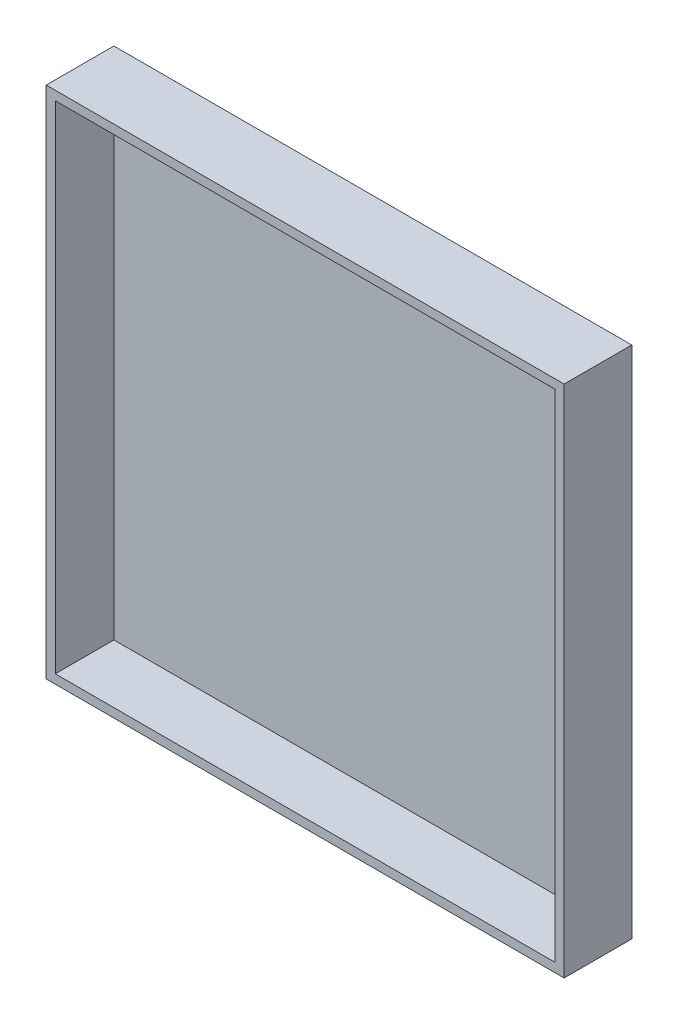
ISO-10303-21;
HEADER;
FILE_DESCRIPTION(('STEP AP214'),'2;1');
FILE_NAME('part.step','',(''),(''),'','','');
FILE_SCHEMA(('AUTOMOTIVE_DESIGN { 1 0 10303 214 1 1 1 1 }'));
ENDSEC;
DATA;
#1=APPLICATION_CONTEXT('core data for automotive mechanical design processes');
#2=APPLICATION_PROTOCOL_DEFINITION('international standard','automotive_design',2000,#1);
#3=PRODUCT_CONTEXT('',#1,'mechanical');
#4=PRODUCT('Part','Part','',(#3));
#5=PRODUCT_RELATED_PRODUCT_CATEGORY('part','',(#4));
#6=PRODUCT_DEFINITION_FORMATION('','',#4);
#7=PRODUCT_DEFINITION_CONTEXT('part definition',#1,'design');
#8=PRODUCT_DEFINITION('design','',#6,#7);
#9=PRODUCT_DEFINITION_SHAPE('','',#8);
#10=(LENGTH_UNIT() NAMED_UNIT(*) SI_UNIT(.MILLI.,.METRE.));
#11=(NAMED_UNIT(*) PLANE_ANGLE_UNIT() SI_UNIT($,.RADIAN.));
#12=(NAMED_UNIT(*) SI_UNIT($,.STERADIAN.) SOLID_ANGLE_UNIT());
#13=UNCERTAINTY_MEASURE_WITH_UNIT(LENGTH_MEASURE(1.E-05),#10,'distance_accuracy_value','');
#14=(GEOMETRIC_REPRESENTATION_CONTEXT(3) GLOBAL_UNCERTAINTY_ASSIGNED_CONTEXT((#13)) GLOBAL_UNIT_ASSIGNED_CONTEXT((#10,
#11,#12)) REPRESENTATION_CONTEXT('',''));
#15=CARTESIAN_POINT('',(0.,0.,0.));
#16=DIRECTION('',(0.,0.,1.));
#17=DIRECTION('',(1.,0.,0.));
#18=AXIS2_PLACEMENT_3D('',#15,#16,#17);
#19=CARTESIAN_POINT('',(4.,0.,15.));
#20=DIRECTION('',(-1.,0.,0.));
#21=DIRECTION('',(0.,0.,1.));
#22=AXIS2_PLACEMENT_3D('',#19,#20,#21);
#23=PLANE('',#22);
#24=DIRECTION('',(0.,1.,0.));
#25=VECTOR('',#24,1.);
#26=CARTESIAN_POINT('',(4.,0.,0.));
#27=LINE('',#26,#25);
#28=CARTESIAN_POINT('',(4.,0.,0.));
#29=VERTEX_POINT('',#28);
#30=CARTESIAN_POINT('',(4.,114.06,0.));
#31=VERTEX_POINT('',#30);
#32=EDGE_CURVE('E140',#29,#31,#27,.T.);
#33=ORIENTED_EDGE('',*,*,#32,.T.);
#34=DIRECTION('',(0.,0.,-1.));
#35=VECTOR('',#34,1.);
#36=CARTESIAN_POINT('',(4.,114.06,15.));
#37=LINE('',#36,#35);
#38=CARTESIAN_POINT('',(4.,114.06,15.));
#39=VERTEX_POINT('',#38);
#40=EDGE_CURVE('E11',#39,#31,#37,.T.);
#41=ORIENTED_EDGE('',*,*,#40,.F.);
#42=DIRECTION('',(0.,1.,0.));
#43=VECTOR('',#42,1.);
#44=CARTESIAN_POINT('',(4.,0.,15.));
#45=LINE('',#44,#43);
#46=CARTESIAN_POINT('',(4.,0.,15.));
#47=VERTEX_POINT('',#46);
#48=EDGE_CURVE('E144',#47,#39,#45,.T.);
#49=ORIENTED_EDGE('',*,*,#48,.F.);
#50=DIRECTION('',(0.,0.,-1.));
#51=VECTOR('',#50,1.);
#52=CARTESIAN_POINT('',(4.,0.,15.));
#53=LINE('',#52,#51);
#54=EDGE_CURVE('E56',#47,#29,#53,.T.);
#55=ORIENTED_EDGE('',*,*,#54,.T.);
#56=EDGE_LOOP('',(#33,#41,#49,#55));
#57=FACE_BOUND('',#56,.T.);
#58=ADVANCED_FACE('F33',(#57),#23,.F.);
#59=CARTESIAN_POINT('',(4.,114.06,15.));
#60=DIRECTION('',(0.,-1.,0.));
#61=DIRECTION('',(1.,0.,0.));
#62=AXIS2_PLACEMENT_3D('',#59,#60,#61);
#63=PLANE('',#62);
#64=DIRECTION('',(-1.,0.,0.));
#65=VECTOR('',#64,1.);
#66=CARTESIAN_POINT('',(4.,114.06,0.));
#67=LINE('',#66,#65);
#68=CARTESIAN_POINT('',(-110.835,114.06,0.));
#69=VERTEX_POINT('',#68);
#70=EDGE_CURVE('E154',#31,#69,#67,.T.);
#71=ORIENTED_EDGE('',*,*,#70,.T.);
#72=DIRECTION('',(0.,0.,-1.));
#73=VECTOR('',#72,1.);
#74=CARTESIAN_POINT('',(-110.835,114.06,15.));
#75=LINE('',#74,#73);
#76=CARTESIAN_POINT('',(-110.835,114.06,15.));
#77=VERTEX_POINT('',#76);
#78=EDGE_CURVE('E40',#77,#69,#75,.T.);
#79=ORIENTED_EDGE('',*,*,#78,.F.);
#80=DIRECTION('',(-1.,0.,0.));
#81=VECTOR('',#80,1.);
#82=CARTESIAN_POINT('',(4.,114.06,15.));
#83=LINE('',#82,#81);
#84=EDGE_CURVE('E82',#39,#77,#83,.T.);
#85=ORIENTED_EDGE('',*,*,#84,.F.);
#86=ORIENTED_EDGE('',*,*,#40,.T.);
#87=EDGE_LOOP('',(#71,#79,#85,#86));
#88=FACE_BOUND('',#87,.T.);
#89=ADVANCED_FACE('F168',(#88),#63,.F.);
#90=CARTESIAN_POINT('',(-110.835,0.,15.));
#91=DIRECTION('',(-1.,0.,0.));
#92=DIRECTION('',(0.,0.,1.));
#93=AXIS2_PLACEMENT_3D('',#90,#91,#92);
#94=PLANE('',#93);
#95=DIRECTION('',(0.,1.,0.));
#96=VECTOR('',#95,1.);
#97=CARTESIAN_POINT('',(-110.835,0.,0.));
#98=LINE('',#97,#96);
#99=CARTESIAN_POINT('',(-110.835,0.,0.));
#100=VERTEX_POINT('',#99);
#101=EDGE_CURVE('E157',#100,#69,#98,.T.);
#102=ORIENTED_EDGE('',*,*,#101,.F.);
#103=DIRECTION('',(0.,0.,-1.));
#104=VECTOR('',#103,1.);
#105=CARTESIAN_POINT('',(-110.835,0.,15.));
#106=LINE('',#105,#104);
#107=CARTESIAN_POINT('',(-110.835,0.,15.));
#108=VERTEX_POINT('',#107);
#109=EDGE_CURVE('E163',#108,#100,#106,.T.);
#110=ORIENTED_EDGE('',*,*,#109,.F.);
#111=DIRECTION('',(0.,1.,0.));
#112=VECTOR('',#111,1.);
#113=CARTESIAN_POINT('',(-110.835,0.,15.));
#114=LINE('',#113,#112);
#115=EDGE_CURVE('E148',#108,#77,#114,.T.);
#116=ORIENTED_EDGE('',*,*,#115,.T.);
#117=ORIENTED_EDGE('',*,*,#78,.T.);
#118=EDGE_LOOP('',(#102,#110,#116,#117));
#119=FACE_BOUND('',#118,.T.);
#120=ADVANCED_FACE('F166',(#119),#94,.T.);
#121=CARTESIAN_POINT('',(4.,0.,15.));
#122=DIRECTION('',(0.,-1.,0.));
#123=DIRECTION('',(1.,0.,0.));
#124=AXIS2_PLACEMENT_3D('',#121,#122,#123);
#125=PLANE('',#124);
#126=DIRECTION('',(-1.,0.,0.));
#127=VECTOR('',#126,1.);
#128=CARTESIAN_POINT('',(4.,0.,0.));
#129=LINE('',#128,#127);
#130=EDGE_CURVE('E146',#29,#100,#129,.T.);
#131=ORIENTED_EDGE('',*,*,#130,.F.);
#132=ORIENTED_EDGE('',*,*,#54,.F.);
#133=DIRECTION('',(-1.,0.,0.));
#134=VECTOR('',#133,1.);
#135=CARTESIAN_POINT('',(4.,0.,15.));
#136=LINE('',#135,#134);
#137=EDGE_CURVE('E151',#47,#108,#136,.T.);
#138=ORIENTED_EDGE('',*,*,#137,.T.);
#139=ORIENTED_EDGE('',*,*,#109,.T.);
#140=EDGE_LOOP('',(#131,#132,#138,#139));
#141=FACE_BOUND('',#140,.T.);
#142=ADVANCED_FACE('F172',(#141),#125,.T.);
#143=CARTESIAN_POINT('',(0.,0.,15.));
#144=DIRECTION('',(0.,0.,1.));
#145=DIRECTION('',(1.,0.,0.));
#146=AXIS2_PLACEMENT_3D('',#143,#144,#145);
#147=PLANE('',#146);
#148=DIRECTION('',(0.,1.,0.));
#149=VECTOR('',#148,1.);
#150=CARTESIAN_POINT('',(2.,2.,15.));
#151=LINE('',#150,#149);
#152=CARTESIAN_POINT('',(2.,2.,15.));
#153=VERTEX_POINT('',#152);
#154=CARTESIAN_POINT('',(2.,112.06,15.));
#155=VERTEX_POINT('',#154);
#156=EDGE_CURVE('E47',#153,#155,#151,.T.);
#157=ORIENTED_EDGE('',*,*,#156,.F.);
#158=DIRECTION('',(1.,0.,0.));
#159=VECTOR('',#158,1.);
#160=CARTESIAN_POINT('',(-108.835,2.,15.));
#161=LINE('',#160,#159);
#162=CARTESIAN_POINT('',(-108.835,2.,15.));
#163=VERTEX_POINT('',#162);
#164=EDGE_CURVE('E125',#163,#153,#161,.T.);
#165=ORIENTED_EDGE('',*,*,#164,.F.);
#166=DIRECTION('',(0.,-1.,0.));
#167=VECTOR('',#166,1.);
#168=CARTESIAN_POINT('',(-108.835,2.,15.));
#169=LINE('',#168,#167);
#170=CARTESIAN_POINT('',(-108.835,112.06,15.));
#171=VERTEX_POINT('',#170);
#172=EDGE_CURVE('E128',#171,#163,#169,.T.);
#173=ORIENTED_EDGE('',*,*,#172,.F.);
#174=DIRECTION('',(-1.,0.,0.));
#175=VECTOR('',#174,1.);
#176=CARTESIAN_POINT('',(-108.835,112.06,15.));
#177=LINE('',#176,#175);
#178=EDGE_CURVE('E134',#155,#171,#177,.T.);
#179=ORIENTED_EDGE('',*,*,#178,.F.);
#180=EDGE_LOOP('',(#157,#165,#173,#179));
#181=FACE_BOUND('',#180,.T.);
#182=ORIENTED_EDGE('',*,*,#48,.T.);
#183=ORIENTED_EDGE('',*,*,#84,.T.);
#184=ORIENTED_EDGE('',*,*,#115,.F.);
#185=ORIENTED_EDGE('',*,*,#137,.F.);
#186=EDGE_LOOP('',(#182,#183,#184,#185));
#187=FACE_BOUND('',#186,.T.);
#188=ADVANCED_FACE('F175',(#181,#187),#147,.T.);
#189=CARTESIAN_POINT('',(0.,0.,0.));
#190=DIRECTION('',(0.,0.,1.));
#191=DIRECTION('',(1.,0.,0.));
#192=AXIS2_PLACEMENT_3D('',#189,#190,#191);
#193=PLANE('',#192);
#194=ORIENTED_EDGE('',*,*,#32,.F.);
#195=ORIENTED_EDGE('',*,*,#130,.T.);
#196=ORIENTED_EDGE('',*,*,#101,.T.);
#197=ORIENTED_EDGE('',*,*,#70,.F.);
#198=EDGE_LOOP('',(#194,#195,#196,#197));
#199=FACE_BOUND('',#198,.T.);
#200=ADVANCED_FACE('F171',(#199),#193,.F.);
#201=CARTESIAN_POINT('',(2.,2.,2.));
#202=DIRECTION('',(1.,0.,0.));
#203=DIRECTION('',(0.,0.,-1.));
#204=AXIS2_PLACEMENT_3D('',#201,#202,#203);
#205=PLANE('',#204);
#206=ORIENTED_EDGE('',*,*,#156,.T.);
#207=DIRECTION('',(0.,0.,1.));
#208=VECTOR('',#207,1.);
#209=CARTESIAN_POINT('',(2.,112.06,2.));
#210=LINE('',#209,#208);
#211=CARTESIAN_POINT('',(2.,112.06,2.));
#212=VERTEX_POINT('',#211);
#213=EDGE_CURVE('E103',#212,#155,#210,.T.);
#214=ORIENTED_EDGE('',*,*,#213,.F.);
#215=DIRECTION('',(0.,1.,0.));
#216=VECTOR('',#215,1.);
#217=CARTESIAN_POINT('',(2.,2.,2.));
#218=LINE('',#217,#216);
#219=CARTESIAN_POINT('',(2.,2.,2.));
#220=VERTEX_POINT('',#219);
#221=EDGE_CURVE('E107',#220,#212,#218,.T.);
#222=ORIENTED_EDGE('',*,*,#221,.F.);
#223=DIRECTION('',(0.,0.,1.));
#224=VECTOR('',#223,1.);
#225=CARTESIAN_POINT('',(2.,2.,2.));
#226=LINE('',#225,#224);
#227=EDGE_CURVE('E138',#220,#153,#226,.T.);
#228=ORIENTED_EDGE('',*,*,#227,.T.);
#229=EDGE_LOOP('',(#206,#214,#222,#228));
#230=FACE_BOUND('',#229,.T.);
#231=ADVANCED_FACE('F105',(#230),#205,.F.);
#232=CARTESIAN_POINT('',(-108.835,2.,2.));
#233=DIRECTION('',(0.,-1.,0.));
#234=DIRECTION('',(0.,0.,-1.));
#235=AXIS2_PLACEMENT_3D('',#232,#233,#234);
#236=PLANE('',#235);
#237=ORIENTED_EDGE('',*,*,#164,.T.);
#238=ORIENTED_EDGE('',*,*,#227,.F.);
#239=DIRECTION('',(1.,0.,0.));
#240=VECTOR('',#239,1.);
#241=CARTESIAN_POINT('',(-108.835,2.,2.));
#242=LINE('',#241,#240);
#243=CARTESIAN_POINT('',(-108.835,2.,2.));
#244=VERTEX_POINT('',#243);
#245=EDGE_CURVE('E113',#244,#220,#242,.T.);
#246=ORIENTED_EDGE('',*,*,#245,.F.);
#247=DIRECTION('',(0.,0.,1.));
#248=VECTOR('',#247,1.);
#249=CARTESIAN_POINT('',(-108.835,2.,2.));
#250=LINE('',#249,#248);
#251=EDGE_CURVE('E141',#244,#163,#250,.T.);
#252=ORIENTED_EDGE('',*,*,#251,.T.);
#253=EDGE_LOOP('',(#237,#238,#246,#252));
#254=FACE_BOUND('',#253,.T.);
#255=ADVANCED_FACE('F194',(#254),#236,.F.);
#256=CARTESIAN_POINT('',(-108.835,2.,2.));
#257=DIRECTION('',(-1.,0.,0.));
#258=DIRECTION('',(0.,0.,1.));
#259=AXIS2_PLACEMENT_3D('',#256,#257,#258);
#260=PLANE('',#259);
#261=ORIENTED_EDGE('',*,*,#172,.T.);
#262=ORIENTED_EDGE('',*,*,#251,.F.);
#263=DIRECTION('',(0.,-1.,0.));
#264=VECTOR('',#263,1.);
#265=CARTESIAN_POINT('',(-108.835,2.,2.));
#266=LINE('',#265,#264);
#267=CARTESIAN_POINT('',(-108.835,112.06,2.));
#268=VERTEX_POINT('',#267);
#269=EDGE_CURVE('E121',#268,#244,#266,.T.);
#270=ORIENTED_EDGE('',*,*,#269,.F.);
#271=DIRECTION('',(0.,0.,1.));
#272=VECTOR('',#271,1.);
#273=CARTESIAN_POINT('',(-108.835,112.06,2.));
#274=LINE('',#273,#272);
#275=EDGE_CURVE('E112',#268,#171,#274,.T.);
#276=ORIENTED_EDGE('',*,*,#275,.T.);
#277=EDGE_LOOP('',(#261,#262,#270,#276));
#278=FACE_BOUND('',#277,.T.);
#279=ADVANCED_FACE('F197',(#278),#260,.F.);
#280=CARTESIAN_POINT('',(-108.835,112.06,2.));
#281=DIRECTION('',(0.,1.,0.));
#282=DIRECTION('',(0.,0.,1.));
#283=AXIS2_PLACEMENT_3D('',#280,#281,#282);
#284=PLANE('',#283);
#285=ORIENTED_EDGE('',*,*,#178,.T.);
#286=ORIENTED_EDGE('',*,*,#275,.F.);
#287=DIRECTION('',(-1.,0.,0.));
#288=VECTOR('',#287,1.);
#289=CARTESIAN_POINT('',(-108.835,112.06,2.));
#290=LINE('',#289,#288);
#291=EDGE_CURVE('E116',#212,#268,#290,.T.);
#292=ORIENTED_EDGE('',*,*,#291,.F.);
#293=ORIENTED_EDGE('',*,*,#213,.T.);
#294=EDGE_LOOP('',(#285,#286,#292,#293));
#295=FACE_BOUND('',#294,.T.);
#296=ADVANCED_FACE('F117',(#295),#284,.F.);
#297=CARTESIAN_POINT('',(0.,0.,2.));
#298=DIRECTION('',(0.,0.,-1.));
#299=DIRECTION('',(-1.,0.,0.));
#300=AXIS2_PLACEMENT_3D('',#297,#298,#299);
#301=PLANE('',#300);
#302=ORIENTED_EDGE('',*,*,#221,.T.);
#303=ORIENTED_EDGE('',*,*,#291,.T.);
#304=ORIENTED_EDGE('',*,*,#269,.T.);
#305=ORIENTED_EDGE('',*,*,#245,.T.);
#306=EDGE_LOOP('',(#302,#303,#304,#305));
#307=FACE_BOUND('',#306,.T.);
#308=ADVANCED_FACE('F123',(#307),#301,.F.);
#309=CLOSED_SHELL('',(#58,#89,#120,#142,#188,#200,#231,#255,#279,#296,#308));
#310=MANIFOLD_SOLID_BREP('B2',#309);
#311=ADVANCED_BREP_SHAPE_REPRESENTATION('',(#18,#310),#14);
#312=SHAPE_DEFINITION_REPRESENTATION(#9,#311);
ENDSEC;
END-ISO-10303-21;
